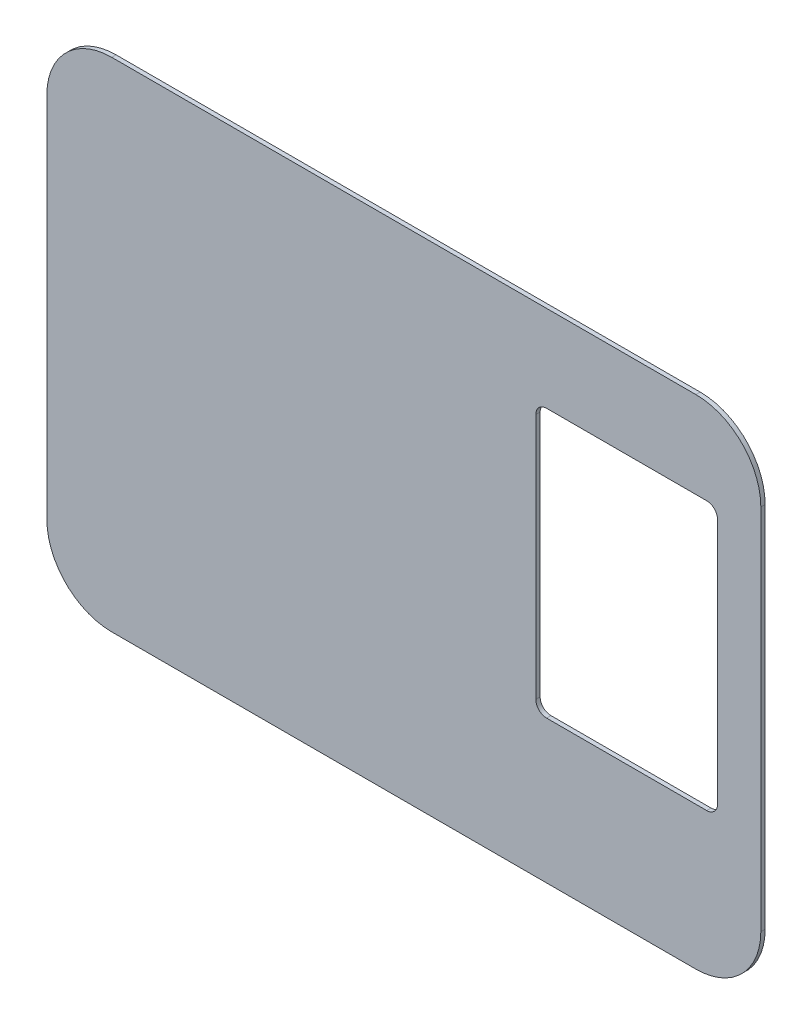
ISO-10303-21;
HEADER;
FILE_DESCRIPTION(('STEP AP214'),'2;1');
FILE_NAME('part.step','',(''),(''),'','','');
FILE_SCHEMA(('AUTOMOTIVE_DESIGN { 1 0 10303 214 1 1 1 1 }'));
ENDSEC;
DATA;
#1=APPLICATION_CONTEXT('core data for automotive mechanical design processes');
#2=APPLICATION_PROTOCOL_DEFINITION('international standard','automotive_design',2000,#1);
#3=PRODUCT_CONTEXT('',#1,'mechanical');
#4=PRODUCT('Part','Part','',(#3));
#5=PRODUCT_RELATED_PRODUCT_CATEGORY('part','',(#4));
#6=PRODUCT_DEFINITION_FORMATION('','',#4);
#7=PRODUCT_DEFINITION_CONTEXT('part definition',#1,'design');
#8=PRODUCT_DEFINITION('design','',#6,#7);
#9=PRODUCT_DEFINITION_SHAPE('','',#8);
#10=(LENGTH_UNIT() NAMED_UNIT(*) SI_UNIT(.MILLI.,.METRE.));
#11=(NAMED_UNIT(*) PLANE_ANGLE_UNIT() SI_UNIT($,.RADIAN.));
#12=(NAMED_UNIT(*) SI_UNIT($,.STERADIAN.) SOLID_ANGLE_UNIT());
#13=UNCERTAINTY_MEASURE_WITH_UNIT(LENGTH_MEASURE(1.E-05),#10,'distance_accuracy_value','');
#14=(GEOMETRIC_REPRESENTATION_CONTEXT(3) GLOBAL_UNCERTAINTY_ASSIGNED_CONTEXT((#13)) GLOBAL_UNIT_ASSIGNED_CONTEXT((#10,
#11,#12)) REPRESENTATION_CONTEXT('',''));
#15=CARTESIAN_POINT('',(0.,0.,0.));
#16=DIRECTION('',(0.,0.,1.));
#17=DIRECTION('',(1.,0.,0.));
#18=AXIS2_PLACEMENT_3D('',#15,#16,#17);
#19=CARTESIAN_POINT('',(165.,115.,2.));
#20=DIRECTION('',(-1.,0.,0.));
#21=DIRECTION('',(0.,-1.,0.));
#22=AXIS2_PLACEMENT_3D('',#19,#20,#21);
#23=PLANE('',#22);
#24=DIRECTION('',(0.,1.,0.));
#25=VECTOR('',#24,1.);
#26=CARTESIAN_POINT('',(165.,115.,2.));
#27=LINE('',#26,#25);
#28=CARTESIAN_POINT('',(165.,-85.,2.));
#29=VERTEX_POINT('',#28);
#30=CARTESIAN_POINT('',(165.,85.,2.));
#31=VERTEX_POINT('',#30);
#32=EDGE_CURVE('E273',#29,#31,#27,.T.);
#33=ORIENTED_EDGE('',*,*,#32,.F.);
#34=DIRECTION('',(0.,0.,-1.));
#35=VECTOR('',#34,1.);
#36=CARTESIAN_POINT('',(165.,-85.,2.));
#37=LINE('',#36,#35);
#38=CARTESIAN_POINT('',(165.,-85.,0.));
#39=VERTEX_POINT('',#38);
#40=EDGE_CURVE('E239',#29,#39,#37,.T.);
#41=ORIENTED_EDGE('',*,*,#40,.T.);
#42=DIRECTION('',(0.,1.,0.));
#43=VECTOR('',#42,1.);
#44=CARTESIAN_POINT('',(165.,115.,0.));
#45=LINE('',#44,#43);
#46=CARTESIAN_POINT('',(165.,85.,0.));
#47=VERTEX_POINT('',#46);
#48=EDGE_CURVE('E221',#39,#47,#45,.T.);
#49=ORIENTED_EDGE('',*,*,#48,.T.);
#50=DIRECTION('',(0.,0.,-1.));
#51=VECTOR('',#50,1.);
#52=CARTESIAN_POINT('',(165.,85.,2.));
#53=LINE('',#52,#51);
#54=EDGE_CURVE('E236',#47,#31,#53,.F.);
#55=ORIENTED_EDGE('',*,*,#54,.T.);
#56=EDGE_LOOP('',(#33,#41,#49,#55));
#57=FACE_BOUND('',#56,.T.);
#58=ADVANCED_FACE('F41',(#57),#23,.F.);
#59=CARTESIAN_POINT('',(-165.,115.,2.));
#60=DIRECTION('',(0.,-1.,0.));
#61=DIRECTION('',(0.,0.,-1.));
#62=AXIS2_PLACEMENT_3D('',#59,#60,#61);
#63=PLANE('',#62);
#64=DIRECTION('',(-1.,0.,0.));
#65=VECTOR('',#64,1.);
#66=CARTESIAN_POINT('',(-165.,115.,2.));
#67=LINE('',#66,#65);
#68=CARTESIAN_POINT('',(135.,115.,2.));
#69=VERTEX_POINT('',#68);
#70=CARTESIAN_POINT('',(-135.,115.,2.));
#71=VERTEX_POINT('',#70);
#72=EDGE_CURVE('E213',#69,#71,#67,.T.);
#73=ORIENTED_EDGE('',*,*,#72,.F.);
#74=DIRECTION('',(0.,0.,-1.));
#75=VECTOR('',#74,1.);
#76=CARTESIAN_POINT('',(135.,115.,2.));
#77=LINE('',#76,#75);
#78=CARTESIAN_POINT('',(135.,115.,0.));
#79=VERTEX_POINT('',#78);
#80=EDGE_CURVE('E12',#69,#79,#77,.T.);
#81=ORIENTED_EDGE('',*,*,#80,.T.);
#82=DIRECTION('',(-1.,0.,0.));
#83=VECTOR('',#82,1.);
#84=CARTESIAN_POINT('',(-165.,115.,0.));
#85=LINE('',#84,#83);
#86=CARTESIAN_POINT('',(-135.,115.,0.));
#87=VERTEX_POINT('',#86);
#88=EDGE_CURVE('E282',#79,#87,#85,.T.);
#89=ORIENTED_EDGE('',*,*,#88,.T.);
#90=DIRECTION('',(0.,0.,-1.));
#91=VECTOR('',#90,1.);
#92=CARTESIAN_POINT('',(-135.,115.,2.));
#93=LINE('',#92,#91);
#94=EDGE_CURVE('E50',#87,#71,#93,.F.);
#95=ORIENTED_EDGE('',*,*,#94,.T.);
#96=EDGE_LOOP('',(#73,#81,#89,#95));
#97=FACE_BOUND('',#96,.T.);
#98=ADVANCED_FACE('F383',(#97),#63,.F.);
#99=CARTESIAN_POINT('',(-165.,115.,2.));
#100=DIRECTION('',(1.,0.,0.));
#101=DIRECTION('',(0.,1.,0.));
#102=AXIS2_PLACEMENT_3D('',#99,#100,#101);
#103=PLANE('',#102);
#104=DIRECTION('',(0.,-1.,0.));
#105=VECTOR('',#104,1.);
#106=CARTESIAN_POINT('',(-165.,115.,0.));
#107=LINE('',#106,#105);
#108=CARTESIAN_POINT('',(-165.,85.,0.));
#109=VERTEX_POINT('',#108);
#110=CARTESIAN_POINT('',(-165.,-85.,0.));
#111=VERTEX_POINT('',#110);
#112=EDGE_CURVE('E278',#109,#111,#107,.T.);
#113=ORIENTED_EDGE('',*,*,#112,.T.);
#114=DIRECTION('',(0.,0.,-1.));
#115=VECTOR('',#114,1.);
#116=CARTESIAN_POINT('',(-165.,-85.,2.));
#117=LINE('',#116,#115);
#118=CARTESIAN_POINT('',(-165.,-85.,2.));
#119=VERTEX_POINT('',#118);
#120=EDGE_CURVE('E247',#111,#119,#117,.F.);
#121=ORIENTED_EDGE('',*,*,#120,.T.);
#122=DIRECTION('',(0.,-1.,0.));
#123=VECTOR('',#122,1.);
#124=CARTESIAN_POINT('',(-165.,115.,2.));
#125=LINE('',#124,#123);
#126=CARTESIAN_POINT('',(-165.,85.,2.));
#127=VERTEX_POINT('',#126);
#128=EDGE_CURVE('E206',#127,#119,#125,.T.);
#129=ORIENTED_EDGE('',*,*,#128,.F.);
#130=DIRECTION('',(0.,0.,-1.));
#131=VECTOR('',#130,1.);
#132=CARTESIAN_POINT('',(-165.,85.,2.));
#133=LINE('',#132,#131);
#134=EDGE_CURVE('E249',#127,#109,#133,.T.);
#135=ORIENTED_EDGE('',*,*,#134,.T.);
#136=EDGE_LOOP('',(#113,#121,#129,#135));
#137=FACE_BOUND('',#136,.T.);
#138=ADVANCED_FACE('F390',(#137),#103,.F.);
#139=CARTESIAN_POINT('',(-165.,-115.,2.));
#140=DIRECTION('',(0.,1.,0.));
#141=DIRECTION('',(0.,0.,1.));
#142=AXIS2_PLACEMENT_3D('',#139,#140,#141);
#143=PLANE('',#142);
#144=DIRECTION('',(1.,0.,0.));
#145=VECTOR('',#144,1.);
#146=CARTESIAN_POINT('',(-165.,-115.,2.));
#147=LINE('',#146,#145);
#148=CARTESIAN_POINT('',(-135.,-115.,2.));
#149=VERTEX_POINT('',#148);
#150=CARTESIAN_POINT('',(135.,-115.,2.));
#151=VERTEX_POINT('',#150);
#152=EDGE_CURVE('E212',#149,#151,#147,.T.);
#153=ORIENTED_EDGE('',*,*,#152,.F.);
#154=DIRECTION('',(0.,0.,-1.));
#155=VECTOR('',#154,1.);
#156=CARTESIAN_POINT('',(-135.,-115.,2.));
#157=LINE('',#156,#155);
#158=CARTESIAN_POINT('',(-135.,-115.,0.));
#159=VERTEX_POINT('',#158);
#160=EDGE_CURVE('E265',#149,#159,#157,.T.);
#161=ORIENTED_EDGE('',*,*,#160,.T.);
#162=DIRECTION('',(1.,0.,0.));
#163=VECTOR('',#162,1.);
#164=CARTESIAN_POINT('',(-165.,-115.,0.));
#165=LINE('',#164,#163);
#166=CARTESIAN_POINT('',(135.,-115.,0.));
#167=VERTEX_POINT('',#166);
#168=EDGE_CURVE('E275',#159,#167,#165,.T.);
#169=ORIENTED_EDGE('',*,*,#168,.T.);
#170=DIRECTION('',(0.,0.,-1.));
#171=VECTOR('',#170,1.);
#172=CARTESIAN_POINT('',(135.,-115.,2.));
#173=LINE('',#172,#171);
#174=EDGE_CURVE('E220',#167,#151,#173,.F.);
#175=ORIENTED_EDGE('',*,*,#174,.T.);
#176=EDGE_LOOP('',(#153,#161,#169,#175));
#177=FACE_BOUND('',#176,.T.);
#178=ADVANCED_FACE('F424',(#177),#143,.F.);
#179=CARTESIAN_POINT('',(0.,0.,2.));
#180=DIRECTION('',(0.,0.,1.));
#181=DIRECTION('',(1.,0.,0.));
#182=AXIS2_PLACEMENT_3D('',#179,#180,#181);
#183=PLANE('',#182);
#184=CARTESIAN_POINT('',(140.,70.,2.));
#185=DIRECTION('',(0.,0.,1.));
#186=DIRECTION('',(1.,0.,0.));
#187=AXIS2_PLACEMENT_3D('',#184,#185,#186);
#188=CIRCLE('',#187,5.);
#189=CARTESIAN_POINT('',(140.,75.,2.));
#190=VERTEX_POINT('',#189);
#191=CARTESIAN_POINT('',(145.,70.,2.));
#192=VERTEX_POINT('',#191);
#193=EDGE_CURVE('E171',#190,#192,#188,.F.);
#194=ORIENTED_EDGE('',*,*,#193,.T.);
#195=DIRECTION('',(0.,-1.,0.));
#196=VECTOR('',#195,1.);
#197=CARTESIAN_POINT('',(145.,0.,2.));
#198=LINE('',#197,#196);
#199=CARTESIAN_POINT('',(145.,-44.,2.));
#200=VERTEX_POINT('',#199);
#201=EDGE_CURVE('E156',#192,#200,#198,.T.);
#202=ORIENTED_EDGE('',*,*,#201,.T.);
#203=CARTESIAN_POINT('',(140.,-44.,2.));
#204=DIRECTION('',(0.,0.,1.));
#205=DIRECTION('',(1.,0.,0.));
#206=AXIS2_PLACEMENT_3D('',#203,#204,#205);
#207=CIRCLE('',#206,5.);
#208=CARTESIAN_POINT('',(140.,-49.,2.));
#209=VERTEX_POINT('',#208);
#210=EDGE_CURVE('E323',#200,#209,#207,.F.);
#211=ORIENTED_EDGE('',*,*,#210,.T.);
#212=DIRECTION('',(-1.,0.,0.));
#213=VECTOR('',#212,1.);
#214=CARTESIAN_POINT('',(0.,-49.,2.));
#215=LINE('',#214,#213);
#216=CARTESIAN_POINT('',(66.,-49.,2.));
#217=VERTEX_POINT('',#216);
#218=EDGE_CURVE('E316',#209,#217,#215,.T.);
#219=ORIENTED_EDGE('',*,*,#218,.T.);
#220=CARTESIAN_POINT('',(66.,-44.,2.));
#221=DIRECTION('',(0.,0.,1.));
#222=DIRECTION('',(1.,0.,0.));
#223=AXIS2_PLACEMENT_3D('',#220,#221,#222);
#224=CIRCLE('',#223,4.99999999999999);
#225=CARTESIAN_POINT('',(61.,-44.,2.));
#226=VERTEX_POINT('',#225);
#227=EDGE_CURVE('E309',#217,#226,#224,.F.);
#228=ORIENTED_EDGE('',*,*,#227,.T.);
#229=DIRECTION('',(0.,-1.,0.));
#230=VECTOR('',#229,1.);
#231=CARTESIAN_POINT('',(61.,0.,2.));
#232=LINE('',#231,#230);
#233=CARTESIAN_POINT('',(61.,70.,2.));
#234=VERTEX_POINT('',#233);
#235=EDGE_CURVE('E335',#234,#226,#232,.T.);
#236=ORIENTED_EDGE('',*,*,#235,.F.);
#237=CARTESIAN_POINT('',(66.,70.,2.));
#238=DIRECTION('',(0.,0.,1.));
#239=DIRECTION('',(1.,0.,0.));
#240=AXIS2_PLACEMENT_3D('',#237,#238,#239);
#241=CIRCLE('',#240,5.);
#242=CARTESIAN_POINT('',(66.,75.,2.));
#243=VERTEX_POINT('',#242);
#244=EDGE_CURVE('E195',#243,#234,#241,.T.);
#245=ORIENTED_EDGE('',*,*,#244,.F.);
#246=DIRECTION('',(-1.,0.,0.));
#247=VECTOR('',#246,1.);
#248=CARTESIAN_POINT('',(0.,75.,2.));
#249=LINE('',#248,#247);
#250=EDGE_CURVE('E180',#190,#243,#249,.T.);
#251=ORIENTED_EDGE('',*,*,#250,.F.);
#252=EDGE_LOOP('',(#194,#202,#211,#219,#228,#236,#245,#251));
#253=FACE_BOUND('',#252,.T.);
#254=ORIENTED_EDGE('',*,*,#128,.T.);
#255=CARTESIAN_POINT('',(-135.,-85.,2.));
#256=DIRECTION('',(0.,0.,1.));
#257=DIRECTION('',(1.,0.,0.));
#258=AXIS2_PLACEMENT_3D('',#255,#256,#257);
#259=CIRCLE('',#258,30.);
#260=EDGE_CURVE('E231',#119,#149,#259,.T.);
#261=ORIENTED_EDGE('',*,*,#260,.T.);
#262=ORIENTED_EDGE('',*,*,#152,.T.);
#263=CARTESIAN_POINT('',(135.,-85.,2.));
#264=DIRECTION('',(0.,0.,1.));
#265=DIRECTION('',(1.,0.,0.));
#266=AXIS2_PLACEMENT_3D('',#263,#264,#265);
#267=CIRCLE('',#266,30.);
#268=EDGE_CURVE('E227',#151,#29,#267,.T.);
#269=ORIENTED_EDGE('',*,*,#268,.T.);
#270=ORIENTED_EDGE('',*,*,#32,.T.);
#271=CARTESIAN_POINT('',(135.,85.,2.));
#272=DIRECTION('',(0.,0.,1.));
#273=DIRECTION('',(1.,0.,0.));
#274=AXIS2_PLACEMENT_3D('',#271,#272,#273);
#275=CIRCLE('',#274,30.);
#276=EDGE_CURVE('E63',#31,#69,#275,.T.);
#277=ORIENTED_EDGE('',*,*,#276,.T.);
#278=ORIENTED_EDGE('',*,*,#72,.T.);
#279=CARTESIAN_POINT('',(-135.,85.,2.));
#280=DIRECTION('',(0.,0.,1.));
#281=DIRECTION('',(1.,0.,0.));
#282=AXIS2_PLACEMENT_3D('',#279,#280,#281);
#283=CIRCLE('',#282,30.);
#284=EDGE_CURVE('E245',#71,#127,#283,.T.);
#285=ORIENTED_EDGE('',*,*,#284,.T.);
#286=EDGE_LOOP('',(#254,#261,#262,#269,#270,#277,#278,#285));
#287=FACE_BOUND('',#286,.T.);
#288=ADVANCED_FACE('F178',(#253,#287),#183,.T.);
#289=CARTESIAN_POINT('',(0.,0.,0.));
#290=DIRECTION('',(0.,0.,1.));
#291=DIRECTION('',(1.,0.,0.));
#292=AXIS2_PLACEMENT_3D('',#289,#290,#291);
#293=PLANE('',#292);
#294=DIRECTION('',(0.,-1.,0.));
#295=VECTOR('',#294,1.);
#296=CARTESIAN_POINT('',(145.,0.,0.));
#297=LINE('',#296,#295);
#298=CARTESIAN_POINT('',(145.,70.,0.));
#299=VERTEX_POINT('',#298);
#300=CARTESIAN_POINT('',(145.,-44.,0.));
#301=VERTEX_POINT('',#300);
#302=EDGE_CURVE('E344',#299,#301,#297,.T.);
#303=ORIENTED_EDGE('',*,*,#302,.F.);
#304=CARTESIAN_POINT('',(140.,70.,0.));
#305=DIRECTION('',(0.,0.,-1.));
#306=DIRECTION('',(-1.,0.,0.));
#307=AXIS2_PLACEMENT_3D('',#304,#305,#306);
#308=CIRCLE('',#307,5.);
#309=CARTESIAN_POINT('',(140.,75.,0.));
#310=VERTEX_POINT('',#309);
#311=EDGE_CURVE('E174',#310,#299,#308,.T.);
#312=ORIENTED_EDGE('',*,*,#311,.F.);
#313=DIRECTION('',(-1.,0.,0.));
#314=VECTOR('',#313,1.);
#315=CARTESIAN_POINT('',(0.,75.,0.));
#316=LINE('',#315,#314);
#317=CARTESIAN_POINT('',(66.,75.,0.));
#318=VERTEX_POINT('',#317);
#319=EDGE_CURVE('E190',#310,#318,#316,.T.);
#320=ORIENTED_EDGE('',*,*,#319,.T.);
#321=CARTESIAN_POINT('',(66.,70.,0.));
#322=DIRECTION('',(0.,0.,-1.));
#323=DIRECTION('',(-1.,0.,0.));
#324=AXIS2_PLACEMENT_3D('',#321,#322,#323);
#325=CIRCLE('',#324,5.);
#326=CARTESIAN_POINT('',(61.,70.,0.));
#327=VERTEX_POINT('',#326);
#328=EDGE_CURVE('E291',#318,#327,#325,.F.);
#329=ORIENTED_EDGE('',*,*,#328,.T.);
#330=DIRECTION('',(0.,-1.,0.));
#331=VECTOR('',#330,1.);
#332=CARTESIAN_POINT('',(61.,0.,0.));
#333=LINE('',#332,#331);
#334=CARTESIAN_POINT('',(61.,-44.,0.));
#335=VERTEX_POINT('',#334);
#336=EDGE_CURVE('E299',#327,#335,#333,.T.);
#337=ORIENTED_EDGE('',*,*,#336,.T.);
#338=CARTESIAN_POINT('',(66.,-44.,0.));
#339=DIRECTION('',(0.,0.,-1.));
#340=DIRECTION('',(-1.,0.,0.));
#341=AXIS2_PLACEMENT_3D('',#338,#339,#340);
#342=CIRCLE('',#341,4.99999999999999);
#343=CARTESIAN_POINT('',(66.,-49.,0.));
#344=VERTEX_POINT('',#343);
#345=EDGE_CURVE('E182',#344,#335,#342,.T.);
#346=ORIENTED_EDGE('',*,*,#345,.F.);
#347=DIRECTION('',(-1.,0.,0.));
#348=VECTOR('',#347,1.);
#349=CARTESIAN_POINT('',(0.,-49.,0.));
#350=LINE('',#349,#348);
#351=CARTESIAN_POINT('',(140.,-49.,0.));
#352=VERTEX_POINT('',#351);
#353=EDGE_CURVE('E186',#352,#344,#350,.T.);
#354=ORIENTED_EDGE('',*,*,#353,.F.);
#355=CARTESIAN_POINT('',(140.,-44.,0.));
#356=DIRECTION('',(0.,0.,-1.));
#357=DIRECTION('',(-1.,0.,0.));
#358=AXIS2_PLACEMENT_3D('',#355,#356,#357);
#359=CIRCLE('',#358,5.);
#360=EDGE_CURVE('E362',#301,#352,#359,.T.);
#361=ORIENTED_EDGE('',*,*,#360,.F.);
#362=EDGE_LOOP('',(#303,#312,#320,#329,#337,#346,#354,#361));
#363=FACE_BOUND('',#362,.T.);
#364=ORIENTED_EDGE('',*,*,#168,.F.);
#365=CARTESIAN_POINT('',(-135.,-85.,0.));
#366=DIRECTION('',(0.,0.,1.));
#367=DIRECTION('',(1.,0.,0.));
#368=AXIS2_PLACEMENT_3D('',#365,#366,#367);
#369=CIRCLE('',#368,30.);
#370=EDGE_CURVE('E253',#159,#111,#369,.F.);
#371=ORIENTED_EDGE('',*,*,#370,.T.);
#372=ORIENTED_EDGE('',*,*,#112,.F.);
#373=CARTESIAN_POINT('',(-135.,85.,0.));
#374=DIRECTION('',(0.,0.,1.));
#375=DIRECTION('',(1.,0.,0.));
#376=AXIS2_PLACEMENT_3D('',#373,#374,#375);
#377=CIRCLE('',#376,30.);
#378=EDGE_CURVE('E262',#109,#87,#377,.F.);
#379=ORIENTED_EDGE('',*,*,#378,.T.);
#380=ORIENTED_EDGE('',*,*,#88,.F.);
#381=CARTESIAN_POINT('',(135.,85.,0.));
#382=DIRECTION('',(0.,0.,1.));
#383=DIRECTION('',(1.,0.,0.));
#384=AXIS2_PLACEMENT_3D('',#381,#382,#383);
#385=CIRCLE('',#384,30.);
#386=EDGE_CURVE('E259',#79,#47,#385,.F.);
#387=ORIENTED_EDGE('',*,*,#386,.T.);
#388=ORIENTED_EDGE('',*,*,#48,.F.);
#389=CARTESIAN_POINT('',(135.,-85.,0.));
#390=DIRECTION('',(0.,0.,1.));
#391=DIRECTION('',(1.,0.,0.));
#392=AXIS2_PLACEMENT_3D('',#389,#390,#391);
#393=CIRCLE('',#392,30.);
#394=EDGE_CURVE('E256',#39,#167,#393,.F.);
#395=ORIENTED_EDGE('',*,*,#394,.T.);
#396=EDGE_LOOP('',(#364,#371,#372,#379,#380,#387,#388,#395));
#397=FACE_BOUND('',#396,.T.);
#398=ADVANCED_FACE('F364',(#363,#397),#293,.F.);
#399=CARTESIAN_POINT('',(140.,70.,151.773161814792));
#400=DIRECTION('',(0.,0.,-1.));
#401=DIRECTION('',(-1.,0.,0.));
#402=AXIS2_PLACEMENT_3D('',#399,#400,#401);
#403=CYLINDRICAL_SURFACE('',#402,5.);
#404=DIRECTION('',(0.,0.,-1.));
#405=VECTOR('',#404,1.);
#406=CARTESIAN_POINT('',(140.,75.,151.773161814792));
#407=LINE('',#406,#405);
#408=EDGE_CURVE('E289',#190,#310,#407,.T.);
#409=ORIENTED_EDGE('',*,*,#408,.T.);
#410=ORIENTED_EDGE('',*,*,#311,.T.);
#411=DIRECTION('',(0.,0.,-1.));
#412=VECTOR('',#411,1.);
#413=CARTESIAN_POINT('',(145.,70.,151.773161814792));
#414=LINE('',#413,#412);
#415=EDGE_CURVE('E160',#192,#299,#414,.T.);
#416=ORIENTED_EDGE('',*,*,#415,.F.);
#417=ORIENTED_EDGE('',*,*,#193,.F.);
#418=EDGE_LOOP('',(#409,#410,#416,#417));
#419=FACE_BOUND('',#418,.T.);
#420=ADVANCED_FACE('F170',(#419),#403,.F.);
#421=CARTESIAN_POINT('',(145.,0.,151.773161814792));
#422=DIRECTION('',(1.,0.,0.));
#423=DIRECTION('',(0.,0.,-1.));
#424=AXIS2_PLACEMENT_3D('',#421,#422,#423);
#425=PLANE('',#424);
#426=ORIENTED_EDGE('',*,*,#415,.T.);
#427=ORIENTED_EDGE('',*,*,#302,.T.);
#428=DIRECTION('',(0.,0.,-1.));
#429=VECTOR('',#428,1.);
#430=CARTESIAN_POINT('',(145.,-44.,151.773161814792));
#431=LINE('',#430,#429);
#432=EDGE_CURVE('E162',#200,#301,#431,.T.);
#433=ORIENTED_EDGE('',*,*,#432,.F.);
#434=ORIENTED_EDGE('',*,*,#201,.F.);
#435=EDGE_LOOP('',(#426,#427,#433,#434));
#436=FACE_BOUND('',#435,.T.);
#437=ADVANCED_FACE('F158',(#436),#425,.F.);
#438=CARTESIAN_POINT('',(140.,-44.,151.773161814792));
#439=DIRECTION('',(0.,0.,-1.));
#440=DIRECTION('',(-1.,0.,0.));
#441=AXIS2_PLACEMENT_3D('',#438,#439,#440);
#442=CYLINDRICAL_SURFACE('',#441,5.);
#443=ORIENTED_EDGE('',*,*,#432,.T.);
#444=ORIENTED_EDGE('',*,*,#360,.T.);
#445=DIRECTION('',(0.,0.,-1.));
#446=VECTOR('',#445,1.);
#447=CARTESIAN_POINT('',(140.,-49.,151.773161814792));
#448=LINE('',#447,#446);
#449=EDGE_CURVE('E320',#209,#352,#448,.T.);
#450=ORIENTED_EDGE('',*,*,#449,.F.);
#451=ORIENTED_EDGE('',*,*,#210,.F.);
#452=EDGE_LOOP('',(#443,#444,#450,#451));
#453=FACE_BOUND('',#452,.T.);
#454=ADVANCED_FACE('F373',(#453),#442,.F.);
#455=CARTESIAN_POINT('',(0.,-49.,151.773161814792));
#456=DIRECTION('',(0.,-1.,0.));
#457=DIRECTION('',(1.,0.,0.));
#458=AXIS2_PLACEMENT_3D('',#455,#456,#457);
#459=PLANE('',#458);
#460=ORIENTED_EDGE('',*,*,#449,.T.);
#461=ORIENTED_EDGE('',*,*,#353,.T.);
#462=DIRECTION('',(0.,0.,-1.));
#463=VECTOR('',#462,1.);
#464=CARTESIAN_POINT('',(66.,-49.,151.773161814792));
#465=LINE('',#464,#463);
#466=EDGE_CURVE('E313',#217,#344,#465,.T.);
#467=ORIENTED_EDGE('',*,*,#466,.F.);
#468=ORIENTED_EDGE('',*,*,#218,.F.);
#469=EDGE_LOOP('',(#460,#461,#467,#468));
#470=FACE_BOUND('',#469,.T.);
#471=ADVANCED_FACE('F355',(#470),#459,.F.);
#472=CARTESIAN_POINT('',(66.,-44.,151.773161814792));
#473=DIRECTION('',(0.,0.,-1.));
#474=DIRECTION('',(-1.,0.,0.));
#475=AXIS2_PLACEMENT_3D('',#472,#473,#474);
#476=CYLINDRICAL_SURFACE('',#475,4.99999999999999);
#477=ORIENTED_EDGE('',*,*,#466,.T.);
#478=ORIENTED_EDGE('',*,*,#345,.T.);
#479=DIRECTION('',(0.,0.,-1.));
#480=VECTOR('',#479,1.);
#481=CARTESIAN_POINT('',(61.,-44.,151.773161814792));
#482=LINE('',#481,#480);
#483=EDGE_CURVE('E306',#226,#335,#482,.T.);
#484=ORIENTED_EDGE('',*,*,#483,.F.);
#485=ORIENTED_EDGE('',*,*,#227,.F.);
#486=EDGE_LOOP('',(#477,#478,#484,#485));
#487=FACE_BOUND('',#486,.T.);
#488=ADVANCED_FACE('F352',(#487),#476,.F.);
#489=CARTESIAN_POINT('',(61.,0.,151.773161814792));
#490=DIRECTION('',(1.,0.,0.));
#491=DIRECTION('',(0.,1.,0.));
#492=AXIS2_PLACEMENT_3D('',#489,#490,#491);
#493=PLANE('',#492);
#494=ORIENTED_EDGE('',*,*,#235,.T.);
#495=ORIENTED_EDGE('',*,*,#483,.T.);
#496=ORIENTED_EDGE('',*,*,#336,.F.);
#497=DIRECTION('',(0.,0.,-1.));
#498=VECTOR('',#497,1.);
#499=CARTESIAN_POINT('',(61.,70.,151.773161814792));
#500=LINE('',#499,#498);
#501=EDGE_CURVE('E303',#234,#327,#500,.T.);
#502=ORIENTED_EDGE('',*,*,#501,.F.);
#503=EDGE_LOOP('',(#494,#495,#496,#502));
#504=FACE_BOUND('',#503,.T.);
#505=ADVANCED_FACE('F349',(#504),#493,.T.);
#506=CARTESIAN_POINT('',(66.,70.,151.773161814792));
#507=DIRECTION('',(0.,0.,-1.));
#508=DIRECTION('',(-1.,0.,0.));
#509=AXIS2_PLACEMENT_3D('',#506,#507,#508);
#510=CYLINDRICAL_SURFACE('',#509,5.);
#511=ORIENTED_EDGE('',*,*,#244,.T.);
#512=ORIENTED_EDGE('',*,*,#501,.T.);
#513=ORIENTED_EDGE('',*,*,#328,.F.);
#514=DIRECTION('',(0.,0.,-1.));
#515=VECTOR('',#514,1.);
#516=CARTESIAN_POINT('',(66.,75.,151.773161814792));
#517=LINE('',#516,#515);
#518=EDGE_CURVE('E295',#243,#318,#517,.T.);
#519=ORIENTED_EDGE('',*,*,#518,.F.);
#520=EDGE_LOOP('',(#511,#512,#513,#519));
#521=FACE_BOUND('',#520,.T.);
#522=ADVANCED_FACE('F347',(#521),#510,.F.);
#523=CARTESIAN_POINT('',(0.,75.,151.773161814792));
#524=DIRECTION('',(0.,-1.,0.));
#525=DIRECTION('',(0.,0.,-1.));
#526=AXIS2_PLACEMENT_3D('',#523,#524,#525);
#527=PLANE('',#526);
#528=ORIENTED_EDGE('',*,*,#250,.T.);
#529=ORIENTED_EDGE('',*,*,#518,.T.);
#530=ORIENTED_EDGE('',*,*,#319,.F.);
#531=ORIENTED_EDGE('',*,*,#408,.F.);
#532=EDGE_LOOP('',(#528,#529,#530,#531));
#533=FACE_BOUND('',#532,.T.);
#534=ADVANCED_FACE('F368',(#533),#527,.T.);
#535=CARTESIAN_POINT('',(-135.,-85.,2.));
#536=DIRECTION('',(0.,0.,-1.));
#537=DIRECTION('',(-1.,0.,0.));
#538=AXIS2_PLACEMENT_3D('',#535,#536,#537);
#539=CYLINDRICAL_SURFACE('',#538,30.);
#540=ORIENTED_EDGE('',*,*,#260,.F.);
#541=ORIENTED_EDGE('',*,*,#120,.F.);
#542=ORIENTED_EDGE('',*,*,#370,.F.);
#543=ORIENTED_EDGE('',*,*,#160,.F.);
#544=EDGE_LOOP('',(#540,#541,#542,#543));
#545=FACE_BOUND('',#544,.T.);
#546=ADVANCED_FACE('F395',(#545),#539,.T.);
#547=CARTESIAN_POINT('',(135.,-85.,2.));
#548=DIRECTION('',(0.,0.,-1.));
#549=DIRECTION('',(-1.,0.,0.));
#550=AXIS2_PLACEMENT_3D('',#547,#548,#549);
#551=CYLINDRICAL_SURFACE('',#550,30.);
#552=ORIENTED_EDGE('',*,*,#268,.F.);
#553=ORIENTED_EDGE('',*,*,#174,.F.);
#554=ORIENTED_EDGE('',*,*,#394,.F.);
#555=ORIENTED_EDGE('',*,*,#40,.F.);
#556=EDGE_LOOP('',(#552,#553,#554,#555));
#557=FACE_BOUND('',#556,.T.);
#558=ADVANCED_FACE('F398',(#557),#551,.T.);
#559=CARTESIAN_POINT('',(135.,85.,2.));
#560=DIRECTION('',(0.,0.,-1.));
#561=DIRECTION('',(-1.,0.,0.));
#562=AXIS2_PLACEMENT_3D('',#559,#560,#561);
#563=CYLINDRICAL_SURFACE('',#562,30.);
#564=ORIENTED_EDGE('',*,*,#276,.F.);
#565=ORIENTED_EDGE('',*,*,#54,.F.);
#566=ORIENTED_EDGE('',*,*,#386,.F.);
#567=ORIENTED_EDGE('',*,*,#80,.F.);
#568=EDGE_LOOP('',(#564,#565,#566,#567));
#569=FACE_BOUND('',#568,.T.);
#570=ADVANCED_FACE('F401',(#569),#563,.T.);
#571=CARTESIAN_POINT('',(-135.,85.,2.));
#572=DIRECTION('',(0.,0.,-1.));
#573=DIRECTION('',(-1.,0.,0.));
#574=AXIS2_PLACEMENT_3D('',#571,#572,#573);
#575=CYLINDRICAL_SURFACE('',#574,30.);
#576=ORIENTED_EDGE('',*,*,#284,.F.);
#577=ORIENTED_EDGE('',*,*,#94,.F.);
#578=ORIENTED_EDGE('',*,*,#378,.F.);
#579=ORIENTED_EDGE('',*,*,#134,.F.);
#580=EDGE_LOOP('',(#576,#577,#578,#579));
#581=FACE_BOUND('',#580,.T.);
#582=ADVANCED_FACE('F43',(#581),#575,.T.);
#583=CLOSED_SHELL('',(#58,#98,#138,#178,#288,#398,#420,#437,#454,#471,#488,#505,#522,#534,#546,
#558,#570,#582));
#584=MANIFOLD_SOLID_BREP('B2',#583);
#585=ADVANCED_BREP_SHAPE_REPRESENTATION('',(#18,#584),#14);
#586=SHAPE_DEFINITION_REPRESENTATION(#9,#585);
ENDSEC;
END-ISO-10303-21;
